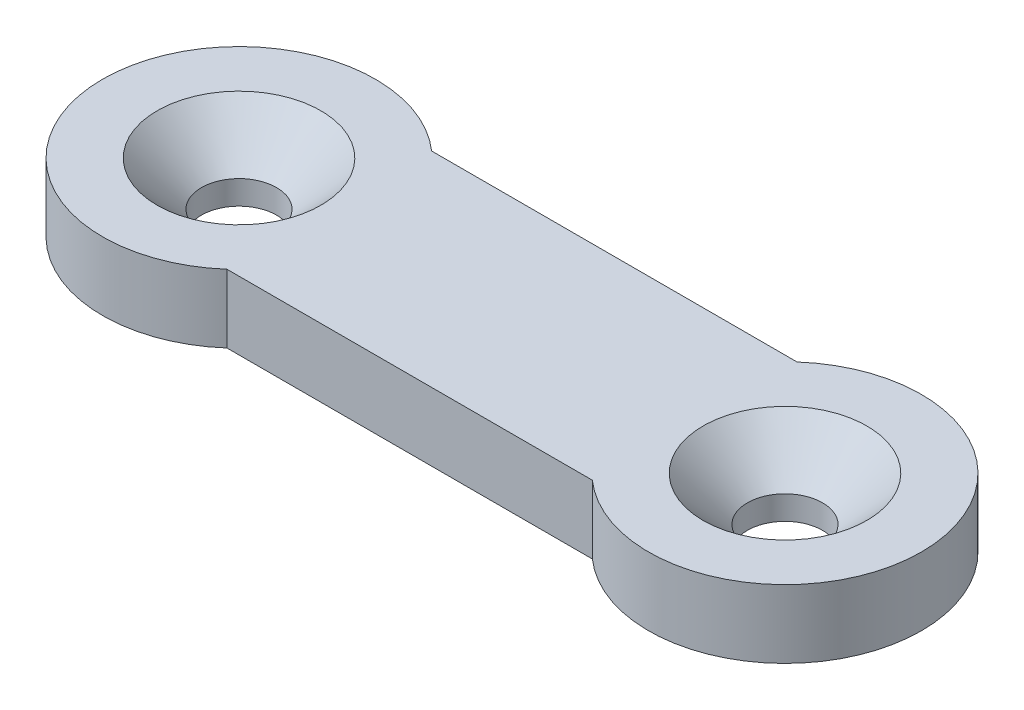
ISO-10303-21;
HEADER;
FILE_DESCRIPTION(('STEP AP214'),'2;1');
FILE_NAME('part.step','',(''),(''),'','','');
FILE_SCHEMA(('AUTOMOTIVE_DESIGN { 1 0 10303 214 1 1 1 1 }'));
ENDSEC;
DATA;
#1=APPLICATION_CONTEXT('core data for automotive mechanical design processes');
#2=APPLICATION_PROTOCOL_DEFINITION('international standard','automotive_design',2000,#1);
#3=PRODUCT_CONTEXT('',#1,'mechanical');
#4=PRODUCT('Part','Part','',(#3));
#5=PRODUCT_RELATED_PRODUCT_CATEGORY('part','',(#4));
#6=PRODUCT_DEFINITION_FORMATION('','',#4);
#7=PRODUCT_DEFINITION_CONTEXT('part definition',#1,'design');
#8=PRODUCT_DEFINITION('design','',#6,#7);
#9=PRODUCT_DEFINITION_SHAPE('','',#8);
#10=(LENGTH_UNIT() NAMED_UNIT(*) SI_UNIT(.MILLI.,.METRE.));
#11=(NAMED_UNIT(*) PLANE_ANGLE_UNIT() SI_UNIT($,.RADIAN.));
#12=(NAMED_UNIT(*) SI_UNIT($,.STERADIAN.) SOLID_ANGLE_UNIT());
#13=UNCERTAINTY_MEASURE_WITH_UNIT(LENGTH_MEASURE(1.E-05),#10,'distance_accuracy_value','');
#14=(GEOMETRIC_REPRESENTATION_CONTEXT(3) GLOBAL_UNCERTAINTY_ASSIGNED_CONTEXT((#13)) GLOBAL_UNIT_ASSIGNED_CONTEXT((#10,
#11,#12)) REPRESENTATION_CONTEXT('',''));
#15=CARTESIAN_POINT('',(0.,0.,0.));
#16=DIRECTION('',(0.,0.,1.));
#17=DIRECTION('',(1.,0.,0.));
#18=AXIS2_PLACEMENT_3D('',#15,#16,#17);
#19=CARTESIAN_POINT('',(-8.,2.,0.));
#20=DIRECTION('',(0.,1.,0.));
#21=DIRECTION('',(0.,0.,1.));
#22=AXIS2_PLACEMENT_3D('',#19,#20,#21);
#23=PLANE('',#22);
#24=CARTESIAN_POINT('',(8.,2.,0.));
#25=DIRECTION('',(0.,1.,0.));
#26=DIRECTION('',(0.,0.,1.));
#27=AXIS2_PLACEMENT_3D('',#24,#25,#26);
#28=CIRCLE('',#27,2.4);
#29=CARTESIAN_POINT('',(8.,2.,2.4));
#30=VERTEX_POINT('',#29);
#31=EDGE_CURVE('E53',#30,#30,#28,.F.);
#32=ORIENTED_EDGE('',*,*,#31,.T.);
#33=EDGE_LOOP('',(#32));
#34=FACE_BOUND('',#33,.T.);
#35=CARTESIAN_POINT('',(-8.,2.,0.));
#36=DIRECTION('',(0.,1.,0.));
#37=DIRECTION('',(0.,0.,1.));
#38=AXIS2_PLACEMENT_3D('',#35,#36,#37);
#39=CIRCLE('',#38,2.4);
#40=CARTESIAN_POINT('',(-8.,2.,2.4));
#41=VERTEX_POINT('',#40);
#42=EDGE_CURVE('E135',#41,#41,#39,.F.);
#43=ORIENTED_EDGE('',*,*,#42,.T.);
#44=EDGE_LOOP('',(#43));
#45=FACE_BOUND('',#44,.T.);
#46=DIRECTION('',(1.,0.,0.));
#47=VECTOR('',#46,1.);
#48=CARTESIAN_POINT('',(-8.,2.,3.));
#49=LINE('',#48,#47);
#50=CARTESIAN_POINT('',(-5.35424868893541,2.,3.));
#51=VERTEX_POINT('',#50);
#52=CARTESIAN_POINT('',(5.35424868893541,2.,3.));
#53=VERTEX_POINT('',#52);
#54=EDGE_CURVE('E98',#51,#53,#49,.T.);
#55=ORIENTED_EDGE('',*,*,#54,.T.);
#56=CARTESIAN_POINT('',(8.,2.,0.));
#57=DIRECTION('',(0.,1.,0.));
#58=DIRECTION('',(0.,0.,1.));
#59=AXIS2_PLACEMENT_3D('',#56,#57,#58);
#60=CIRCLE('',#59,4.);
#61=CARTESIAN_POINT('',(5.35424868893541,2.,-3.));
#62=VERTEX_POINT('',#61);
#63=EDGE_CURVE('E107',#53,#62,#60,.T.);
#64=ORIENTED_EDGE('',*,*,#63,.T.);
#65=DIRECTION('',(-1.,0.,0.));
#66=VECTOR('',#65,1.);
#67=CARTESIAN_POINT('',(-8.,2.,-3.));
#68=LINE('',#67,#66);
#69=CARTESIAN_POINT('',(-5.35424868893541,2.,-3.));
#70=VERTEX_POINT('',#69);
#71=EDGE_CURVE('E103',#62,#70,#68,.T.);
#72=ORIENTED_EDGE('',*,*,#71,.T.);
#73=CARTESIAN_POINT('',(-8.,2.,0.));
#74=DIRECTION('',(0.,1.,0.));
#75=DIRECTION('',(0.,0.,1.));
#76=AXIS2_PLACEMENT_3D('',#73,#74,#75);
#77=CIRCLE('',#76,4.);
#78=EDGE_CURVE('E111',#70,#51,#77,.T.);
#79=ORIENTED_EDGE('',*,*,#78,.T.);
#80=EDGE_LOOP('',(#55,#64,#72,#79));
#81=FACE_BOUND('',#80,.T.);
#82=ADVANCED_FACE('F44',(#34,#45,#81),#23,.T.);
#83=CARTESIAN_POINT('',(-8.,0.,0.));
#84=DIRECTION('',(0.,1.,0.));
#85=DIRECTION('',(0.,0.,1.));
#86=AXIS2_PLACEMENT_3D('',#83,#84,#85);
#87=PLANE('',#86);
#88=DIRECTION('',(-1.,0.,0.));
#89=VECTOR('',#88,1.);
#90=CARTESIAN_POINT('',(-8.,0.,-3.));
#91=LINE('',#90,#89);
#92=CARTESIAN_POINT('',(5.35424868893541,0.,-3.));
#93=VERTEX_POINT('',#92);
#94=CARTESIAN_POINT('',(-5.35424868893541,0.,-3.));
#95=VERTEX_POINT('',#94);
#96=EDGE_CURVE('E82',#93,#95,#91,.T.);
#97=ORIENTED_EDGE('',*,*,#96,.F.);
#98=CARTESIAN_POINT('',(8.,0.,0.));
#99=DIRECTION('',(0.,1.,0.));
#100=DIRECTION('',(0.,0.,1.));
#101=AXIS2_PLACEMENT_3D('',#98,#99,#100);
#102=CIRCLE('',#101,4.);
#103=CARTESIAN_POINT('',(5.35424868893541,0.,3.));
#104=VERTEX_POINT('',#103);
#105=EDGE_CURVE('E88',#93,#104,#102,.F.);
#106=ORIENTED_EDGE('',*,*,#105,.T.);
#107=DIRECTION('',(1.,0.,0.));
#108=VECTOR('',#107,1.);
#109=CARTESIAN_POINT('',(-8.,0.,3.));
#110=LINE('',#109,#108);
#111=CARTESIAN_POINT('',(-5.35424868893541,0.,3.));
#112=VERTEX_POINT('',#111);
#113=EDGE_CURVE('E64',#112,#104,#110,.T.);
#114=ORIENTED_EDGE('',*,*,#113,.F.);
#115=CARTESIAN_POINT('',(-8.,0.,0.));
#116=DIRECTION('',(0.,1.,0.));
#117=DIRECTION('',(0.,0.,1.));
#118=AXIS2_PLACEMENT_3D('',#115,#116,#117);
#119=CIRCLE('',#118,4.);
#120=EDGE_CURVE('E95',#112,#95,#119,.F.);
#121=ORIENTED_EDGE('',*,*,#120,.T.);
#122=EDGE_LOOP('',(#97,#106,#114,#121));
#123=FACE_BOUND('',#122,.T.);
#124=CARTESIAN_POINT('',(-8.,0.,0.));
#125=DIRECTION('',(0.,1.,0.));
#126=DIRECTION('',(0.,0.,1.));
#127=AXIS2_PLACEMENT_3D('',#124,#125,#126);
#128=CIRCLE('',#127,1.1);
#129=CARTESIAN_POINT('',(-8.,0.,1.1));
#130=VERTEX_POINT('',#129);
#131=EDGE_CURVE('E124',#130,#130,#128,.T.);
#132=ORIENTED_EDGE('',*,*,#131,.T.);
#133=EDGE_LOOP('',(#132));
#134=FACE_BOUND('',#133,.T.);
#135=CARTESIAN_POINT('',(8.,0.,0.));
#136=DIRECTION('',(0.,1.,0.));
#137=DIRECTION('',(0.,0.,1.));
#138=AXIS2_PLACEMENT_3D('',#135,#136,#137);
#139=CIRCLE('',#138,1.1);
#140=CARTESIAN_POINT('',(8.,0.,1.1));
#141=VERTEX_POINT('',#140);
#142=EDGE_CURVE('E119',#141,#141,#139,.T.);
#143=ORIENTED_EDGE('',*,*,#142,.T.);
#144=EDGE_LOOP('',(#143));
#145=FACE_BOUND('',#144,.T.);
#146=ADVANCED_FACE('F90',(#123,#134,#145),#87,.F.);
#147=CARTESIAN_POINT('',(-8.,2.,3.));
#148=DIRECTION('',(0.,0.,-1.));
#149=DIRECTION('',(-1.,0.,0.));
#150=AXIS2_PLACEMENT_3D('',#147,#148,#149);
#151=PLANE('',#150);
#152=ORIENTED_EDGE('',*,*,#113,.T.);
#153=DIRECTION('',(0.,1.,0.));
#154=VECTOR('',#153,1.);
#155=CARTESIAN_POINT('',(5.35424868893541,-11.3137084989848,3.));
#156=LINE('',#155,#154);
#157=EDGE_CURVE('E62',#104,#53,#156,.T.);
#158=ORIENTED_EDGE('',*,*,#157,.T.);
#159=ORIENTED_EDGE('',*,*,#54,.F.);
#160=DIRECTION('',(0.,1.,0.));
#161=VECTOR('',#160,1.);
#162=CARTESIAN_POINT('',(-5.35424868893541,-11.3137084989848,3.));
#163=LINE('',#162,#161);
#164=EDGE_CURVE('E116',#51,#112,#163,.F.);
#165=ORIENTED_EDGE('',*,*,#164,.T.);
#166=EDGE_LOOP('',(#152,#158,#159,#165));
#167=FACE_BOUND('',#166,.T.);
#168=ADVANCED_FACE('F154',(#167),#151,.F.);
#169=CARTESIAN_POINT('',(-8.,2.,-3.));
#170=DIRECTION('',(0.,0.,1.));
#171=DIRECTION('',(1.,0.,0.));
#172=AXIS2_PLACEMENT_3D('',#169,#170,#171);
#173=PLANE('',#172);
#174=ORIENTED_EDGE('',*,*,#71,.F.);
#175=DIRECTION('',(0.,1.,0.));
#176=VECTOR('',#175,1.);
#177=CARTESIAN_POINT('',(5.35424868893541,-11.3137084989848,-3.));
#178=LINE('',#177,#176);
#179=EDGE_CURVE('E100',#62,#93,#178,.F.);
#180=ORIENTED_EDGE('',*,*,#179,.T.);
#181=ORIENTED_EDGE('',*,*,#96,.T.);
#182=DIRECTION('',(0.,1.,0.));
#183=VECTOR('',#182,1.);
#184=CARTESIAN_POINT('',(-5.35424868893541,-11.3137084989848,-3.));
#185=LINE('',#184,#183);
#186=EDGE_CURVE('E106',#95,#70,#185,.T.);
#187=ORIENTED_EDGE('',*,*,#186,.T.);
#188=EDGE_LOOP('',(#174,#180,#181,#187));
#189=FACE_BOUND('',#188,.T.);
#190=ADVANCED_FACE('F99',(#189),#173,.F.);
#191=CARTESIAN_POINT('',(-8.,2.,0.));
#192=DIRECTION('',(0.,-1.,0.));
#193=DIRECTION('',(0.,0.,-1.));
#194=AXIS2_PLACEMENT_3D('',#191,#192,#193);
#195=CYLINDRICAL_SURFACE('',#194,1.1);
#196=CARTESIAN_POINT('',(-8.,0.700000000000002,0.));
#197=DIRECTION('',(0.,1.,0.));
#198=DIRECTION('',(0.,0.,1.));
#199=AXIS2_PLACEMENT_3D('',#196,#197,#198);
#200=CIRCLE('',#199,1.1);
#201=CARTESIAN_POINT('',(-8.,0.700000000000002,1.1));
#202=VERTEX_POINT('',#201);
#203=EDGE_CURVE('E11',#202,#202,#200,.T.);
#204=ORIENTED_EDGE('',*,*,#203,.T.);
#205=EDGE_LOOP('',(#204));
#206=FACE_BOUND('',#205,.T.);
#207=ORIENTED_EDGE('',*,*,#131,.F.);
#208=EDGE_LOOP('',(#207));
#209=FACE_BOUND('',#208,.T.);
#210=ADVANCED_FACE('F150',(#206,#209),#195,.F.);
#211=CARTESIAN_POINT('',(8.,2.,0.));
#212=DIRECTION('',(0.,-1.,0.));
#213=DIRECTION('',(0.,0.,-1.));
#214=AXIS2_PLACEMENT_3D('',#211,#212,#213);
#215=CYLINDRICAL_SURFACE('',#214,1.1);
#216=CARTESIAN_POINT('',(8.,0.700000000000009,0.));
#217=DIRECTION('',(0.,1.,0.));
#218=DIRECTION('',(0.,0.,1.));
#219=AXIS2_PLACEMENT_3D('',#216,#217,#218);
#220=CIRCLE('',#219,1.1);
#221=CARTESIAN_POINT('',(8.,0.700000000000009,1.1));
#222=VERTEX_POINT('',#221);
#223=EDGE_CURVE('E102',#222,#222,#220,.T.);
#224=ORIENTED_EDGE('',*,*,#223,.T.);
#225=EDGE_LOOP('',(#224));
#226=FACE_BOUND('',#225,.T.);
#227=ORIENTED_EDGE('',*,*,#142,.F.);
#228=EDGE_LOOP('',(#227));
#229=FACE_BOUND('',#228,.T.);
#230=ADVANCED_FACE('F144',(#226,#229),#215,.F.);
#231=CARTESIAN_POINT('',(-8.,-11.3137084989848,0.));
#232=DIRECTION('',(0.,1.,0.));
#233=DIRECTION('',(0.,0.,1.));
#234=AXIS2_PLACEMENT_3D('',#231,#232,#233);
#235=CYLINDRICAL_SURFACE('',#234,4.);
#236=ORIENTED_EDGE('',*,*,#164,.F.);
#237=ORIENTED_EDGE('',*,*,#78,.F.);
#238=ORIENTED_EDGE('',*,*,#186,.F.);
#239=ORIENTED_EDGE('',*,*,#120,.F.);
#240=EDGE_LOOP('',(#236,#237,#238,#239));
#241=FACE_BOUND('',#240,.T.);
#242=ADVANCED_FACE('F146',(#241),#235,.T.);
#243=CARTESIAN_POINT('',(8.,-11.3137084989848,0.));
#244=DIRECTION('',(0.,1.,0.));
#245=DIRECTION('',(0.,0.,1.));
#246=AXIS2_PLACEMENT_3D('',#243,#244,#245);
#247=CYLINDRICAL_SURFACE('',#246,4.);
#248=ORIENTED_EDGE('',*,*,#157,.F.);
#249=ORIENTED_EDGE('',*,*,#105,.F.);
#250=ORIENTED_EDGE('',*,*,#179,.F.);
#251=ORIENTED_EDGE('',*,*,#63,.F.);
#252=EDGE_LOOP('',(#248,#249,#250,#251));
#253=FACE_BOUND('',#252,.T.);
#254=ADVANCED_FACE('F108',(#253),#247,.T.);
#255=CARTESIAN_POINT('',(8.,0.700000000000009,0.));
#256=DIRECTION('',(0.,1.,0.));
#257=DIRECTION('',(0.,0.,1.));
#258=AXIS2_PLACEMENT_3D('',#255,#256,#257);
#259=CONICAL_SURFACE('',#258,1.1,0.785398163397451);
#260=ORIENTED_EDGE('',*,*,#31,.F.);
#261=EDGE_LOOP('',(#260));
#262=FACE_BOUND('',#261,.T.);
#263=ORIENTED_EDGE('',*,*,#223,.F.);
#264=EDGE_LOOP('',(#263));
#265=FACE_BOUND('',#264,.T.);
#266=ADVANCED_FACE('F137',(#262,#265),#259,.F.);
#267=CARTESIAN_POINT('',(-8.,0.700000000000002,0.));
#268=DIRECTION('',(0.,1.,0.));
#269=DIRECTION('',(0.,0.,1.));
#270=AXIS2_PLACEMENT_3D('',#267,#268,#269);
#271=CONICAL_SURFACE('',#270,1.1,0.78539816339745);
#272=ORIENTED_EDGE('',*,*,#42,.F.);
#273=EDGE_LOOP('',(#272));
#274=FACE_BOUND('',#273,.T.);
#275=ORIENTED_EDGE('',*,*,#203,.F.);
#276=EDGE_LOOP('',(#275));
#277=FACE_BOUND('',#276,.T.);
#278=ADVANCED_FACE('F48',(#274,#277),#271,.F.);
#279=CLOSED_SHELL('',(#82,#146,#168,#190,#210,#230,#242,#254,#266,#278));
#280=MANIFOLD_SOLID_BREP('B2',#279);
#281=ADVANCED_BREP_SHAPE_REPRESENTATION('',(#18,#280),#14);
#282=SHAPE_DEFINITION_REPRESENTATION(#9,#281);
ENDSEC;
END-ISO-10303-21;
